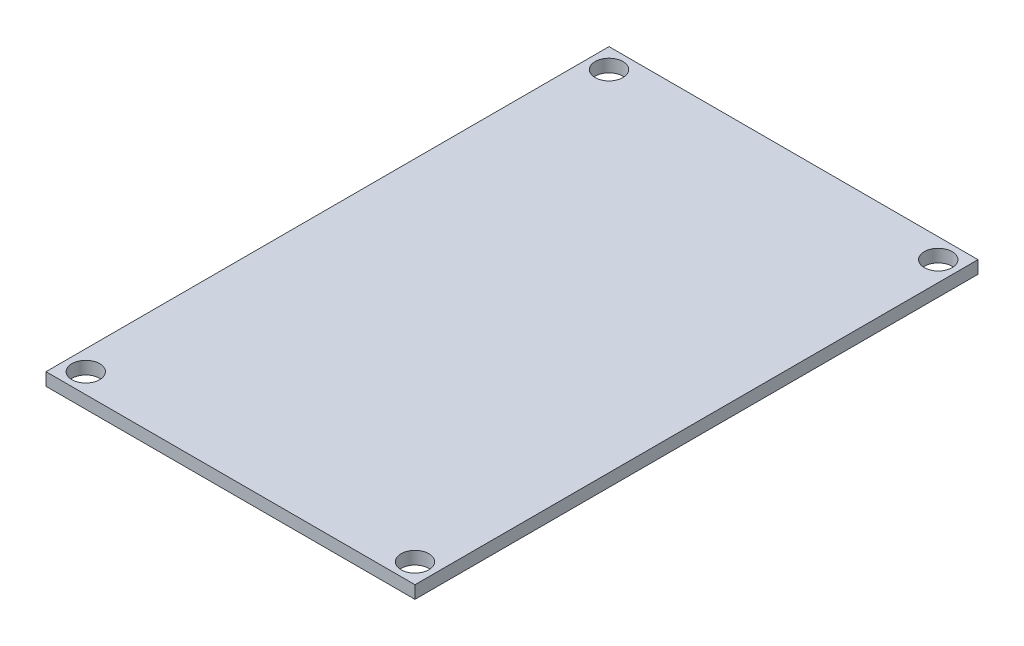
ISO-10303-21;
HEADER;
FILE_DESCRIPTION(('STEP AP214'),'2;1');
FILE_NAME('part.step','',(''),(''),'','','');
FILE_SCHEMA(('AUTOMOTIVE_DESIGN { 1 0 10303 214 1 1 1 1 }'));
ENDSEC;
DATA;
#1=APPLICATION_CONTEXT('core data for automotive mechanical design processes');
#2=APPLICATION_PROTOCOL_DEFINITION('international standard','automotive_design',2000,#1);
#3=PRODUCT_CONTEXT('',#1,'mechanical');
#4=PRODUCT('Part','Part','',(#3));
#5=PRODUCT_RELATED_PRODUCT_CATEGORY('part','',(#4));
#6=PRODUCT_DEFINITION_FORMATION('','',#4);
#7=PRODUCT_DEFINITION_CONTEXT('part definition',#1,'design');
#8=PRODUCT_DEFINITION('design','',#6,#7);
#9=PRODUCT_DEFINITION_SHAPE('','',#8);
#10=(LENGTH_UNIT() NAMED_UNIT(*) SI_UNIT(.MILLI.,.METRE.));
#11=(NAMED_UNIT(*) PLANE_ANGLE_UNIT() SI_UNIT($,.RADIAN.));
#12=(NAMED_UNIT(*) SI_UNIT($,.STERADIAN.) SOLID_ANGLE_UNIT());
#13=UNCERTAINTY_MEASURE_WITH_UNIT(LENGTH_MEASURE(1.E-05),#10,'distance_accuracy_value','');
#14=(GEOMETRIC_REPRESENTATION_CONTEXT(3) GLOBAL_UNCERTAINTY_ASSIGNED_CONTEXT((#13)) GLOBAL_UNIT_ASSIGNED_CONTEXT((#10,
#11,#12)) REPRESENTATION_CONTEXT('',''));
#15=CARTESIAN_POINT('',(0.,0.,0.));
#16=DIRECTION('',(0.,0.,1.));
#17=DIRECTION('',(1.,0.,0.));
#18=AXIS2_PLACEMENT_3D('',#15,#16,#17);
#19=CARTESIAN_POINT('',(23.5712,1.6256,-35.9664));
#20=DIRECTION('',(-1.,0.,0.));
#21=DIRECTION('',(0.,0.,1.));
#22=AXIS2_PLACEMENT_3D('',#19,#20,#21);
#23=PLANE('',#22);
#24=DIRECTION('',(0.,0.,-1.));
#25=VECTOR('',#24,1.);
#26=CARTESIAN_POINT('',(23.5712,0.,-35.9664));
#27=LINE('',#26,#25);
#28=CARTESIAN_POINT('',(23.5712,0.,35.9664));
#29=VERTEX_POINT('',#28);
#30=CARTESIAN_POINT('',(23.5712,0.,-35.9664));
#31=VERTEX_POINT('',#30);
#32=EDGE_CURVE('E96',#29,#31,#27,.T.);
#33=ORIENTED_EDGE('',*,*,#32,.T.);
#34=DIRECTION('',(0.,-1.,0.));
#35=VECTOR('',#34,1.);
#36=CARTESIAN_POINT('',(23.5712,1.6256,-35.9664));
#37=LINE('',#36,#35);
#38=CARTESIAN_POINT('',(23.5712,1.6256,-35.9664));
#39=VERTEX_POINT('',#38);
#40=EDGE_CURVE('E11',#39,#31,#37,.T.);
#41=ORIENTED_EDGE('',*,*,#40,.F.);
#42=DIRECTION('',(0.,0.,-1.));
#43=VECTOR('',#42,1.);
#44=CARTESIAN_POINT('',(23.5712,1.6256,-35.9664));
#45=LINE('',#44,#43);
#46=CARTESIAN_POINT('',(23.5712,1.6256,35.9664));
#47=VERTEX_POINT('',#46);
#48=EDGE_CURVE('E84',#47,#39,#45,.T.);
#49=ORIENTED_EDGE('',*,*,#48,.F.);
#50=DIRECTION('',(0.,-1.,0.));
#51=VECTOR('',#50,1.);
#52=CARTESIAN_POINT('',(23.5712,1.6256,35.9664));
#53=LINE('',#52,#51);
#54=EDGE_CURVE('E92',#47,#29,#53,.T.);
#55=ORIENTED_EDGE('',*,*,#54,.T.);
#56=EDGE_LOOP('',(#33,#41,#49,#55));
#57=FACE_BOUND('',#56,.T.);
#58=ADVANCED_FACE('F33',(#57),#23,.F.);
#59=CARTESIAN_POINT('',(-23.5712,1.6256,-35.9664));
#60=DIRECTION('',(0.,0.,1.));
#61=DIRECTION('',(1.,0.,0.));
#62=AXIS2_PLACEMENT_3D('',#59,#60,#61);
#63=PLANE('',#62);
#64=DIRECTION('',(-1.,0.,0.));
#65=VECTOR('',#64,1.);
#66=CARTESIAN_POINT('',(-23.5712,0.,-35.9664));
#67=LINE('',#66,#65);
#68=CARTESIAN_POINT('',(-23.5712,0.,-35.9664));
#69=VERTEX_POINT('',#68);
#70=EDGE_CURVE('E88',#31,#69,#67,.T.);
#71=ORIENTED_EDGE('',*,*,#70,.T.);
#72=DIRECTION('',(0.,-1.,0.));
#73=VECTOR('',#72,1.);
#74=CARTESIAN_POINT('',(-23.5712,1.6256,-35.9664));
#75=LINE('',#74,#73);
#76=CARTESIAN_POINT('',(-23.5712,1.6256,-35.9664));
#77=VERTEX_POINT('',#76);
#78=EDGE_CURVE('E41',#77,#69,#75,.T.);
#79=ORIENTED_EDGE('',*,*,#78,.F.);
#80=DIRECTION('',(-1.,0.,0.));
#81=VECTOR('',#80,1.);
#82=CARTESIAN_POINT('',(-23.5712,1.6256,-35.9664));
#83=LINE('',#82,#81);
#84=EDGE_CURVE('E79',#39,#77,#83,.T.);
#85=ORIENTED_EDGE('',*,*,#84,.F.);
#86=ORIENTED_EDGE('',*,*,#40,.T.);
#87=EDGE_LOOP('',(#71,#79,#85,#86));
#88=FACE_BOUND('',#87,.T.);
#89=ADVANCED_FACE('F87',(#88),#63,.F.);
#90=CARTESIAN_POINT('',(-23.5712,1.6256,-35.9664));
#91=DIRECTION('',(1.,0.,0.));
#92=DIRECTION('',(0.,0.,-1.));
#93=AXIS2_PLACEMENT_3D('',#90,#91,#92);
#94=PLANE('',#93);
#95=DIRECTION('',(0.,0.,1.));
#96=VECTOR('',#95,1.);
#97=CARTESIAN_POINT('',(-23.5712,0.,-35.9664));
#98=LINE('',#97,#96);
#99=CARTESIAN_POINT('',(-23.5712,0.,35.9664));
#100=VERTEX_POINT('',#99);
#101=EDGE_CURVE('E66',#69,#100,#98,.T.);
#102=ORIENTED_EDGE('',*,*,#101,.T.);
#103=DIRECTION('',(0.,-1.,0.));
#104=VECTOR('',#103,1.);
#105=CARTESIAN_POINT('',(-23.5712,1.6256,35.9664));
#106=LINE('',#105,#104);
#107=CARTESIAN_POINT('',(-23.5712,1.6256,35.9664));
#108=VERTEX_POINT('',#107);
#109=EDGE_CURVE('E89',#108,#100,#106,.T.);
#110=ORIENTED_EDGE('',*,*,#109,.F.);
#111=DIRECTION('',(0.,0.,1.));
#112=VECTOR('',#111,1.);
#113=CARTESIAN_POINT('',(-23.5712,1.6256,-35.9664));
#114=LINE('',#113,#112);
#115=EDGE_CURVE('E82',#77,#108,#114,.T.);
#116=ORIENTED_EDGE('',*,*,#115,.F.);
#117=ORIENTED_EDGE('',*,*,#78,.T.);
#118=EDGE_LOOP('',(#102,#110,#116,#117));
#119=FACE_BOUND('',#118,.T.);
#120=ADVANCED_FACE('F90',(#119),#94,.F.);
#121=CARTESIAN_POINT('',(-23.5712,1.6256,35.9664));
#122=DIRECTION('',(0.,0.,-1.));
#123=DIRECTION('',(-1.,0.,0.));
#124=AXIS2_PLACEMENT_3D('',#121,#122,#123);
#125=PLANE('',#124);
#126=DIRECTION('',(1.,0.,0.));
#127=VECTOR('',#126,1.);
#128=CARTESIAN_POINT('',(-23.5712,0.,35.9664));
#129=LINE('',#128,#127);
#130=EDGE_CURVE('E72',#100,#29,#129,.T.);
#131=ORIENTED_EDGE('',*,*,#130,.T.);
#132=ORIENTED_EDGE('',*,*,#54,.F.);
#133=DIRECTION('',(1.,0.,0.));
#134=VECTOR('',#133,1.);
#135=CARTESIAN_POINT('',(-23.5712,1.6256,35.9664));
#136=LINE('',#135,#134);
#137=EDGE_CURVE('E49',#108,#47,#136,.T.);
#138=ORIENTED_EDGE('',*,*,#137,.F.);
#139=ORIENTED_EDGE('',*,*,#109,.T.);
#140=EDGE_LOOP('',(#131,#132,#138,#139));
#141=FACE_BOUND('',#140,.T.);
#142=ADVANCED_FACE('F104',(#141),#125,.F.);
#143=CARTESIAN_POINT('',(0.,1.6256,0.));
#144=DIRECTION('',(0.,1.,0.));
#145=DIRECTION('',(0.,0.,1.));
#146=AXIS2_PLACEMENT_3D('',#143,#144,#145);
#147=PLANE('',#146);
#148=CARTESIAN_POINT('',(21.0312,1.6256,33.4264));
#149=DIRECTION('',(0.,1.,0.));
#150=DIRECTION('',(0.,0.,1.));
#151=AXIS2_PLACEMENT_3D('',#148,#149,#150);
#152=CIRCLE('',#151,1.778);
#153=CARTESIAN_POINT('',(21.0312,1.6256,35.2044));
#154=VERTEX_POINT('',#153);
#155=EDGE_CURVE('E128',#154,#154,#152,.T.);
#156=ORIENTED_EDGE('',*,*,#155,.F.);
#157=EDGE_LOOP('',(#156));
#158=FACE_BOUND('',#157,.T.);
#159=CARTESIAN_POINT('',(-21.0312,1.6256,33.4264));
#160=DIRECTION('',(0.,1.,0.));
#161=DIRECTION('',(0.,0.,1.));
#162=AXIS2_PLACEMENT_3D('',#159,#160,#161);
#163=CIRCLE('',#162,1.778);
#164=CARTESIAN_POINT('',(-21.0312,1.6256,35.2044));
#165=VERTEX_POINT('',#164);
#166=EDGE_CURVE('E122',#165,#165,#163,.T.);
#167=ORIENTED_EDGE('',*,*,#166,.F.);
#168=EDGE_LOOP('',(#167));
#169=FACE_BOUND('',#168,.T.);
#170=CARTESIAN_POINT('',(21.0312,1.6256,-33.4264));
#171=DIRECTION('',(0.,1.,0.));
#172=DIRECTION('',(0.,0.,1.));
#173=AXIS2_PLACEMENT_3D('',#170,#171,#172);
#174=CIRCLE('',#173,1.778);
#175=CARTESIAN_POINT('',(21.0312,1.6256,-31.6484));
#176=VERTEX_POINT('',#175);
#177=EDGE_CURVE('E116',#176,#176,#174,.T.);
#178=ORIENTED_EDGE('',*,*,#177,.F.);
#179=EDGE_LOOP('',(#178));
#180=FACE_BOUND('',#179,.T.);
#181=CARTESIAN_POINT('',(-21.0312,1.6256,-33.4264));
#182=DIRECTION('',(0.,1.,0.));
#183=DIRECTION('',(0.,0.,1.));
#184=AXIS2_PLACEMENT_3D('',#181,#182,#183);
#185=CIRCLE('',#184,1.778);
#186=CARTESIAN_POINT('',(-21.0312,1.6256,-31.6484));
#187=VERTEX_POINT('',#186);
#188=EDGE_CURVE('E110',#187,#187,#185,.T.);
#189=ORIENTED_EDGE('',*,*,#188,.F.);
#190=EDGE_LOOP('',(#189));
#191=FACE_BOUND('',#190,.T.);
#192=ORIENTED_EDGE('',*,*,#48,.T.);
#193=ORIENTED_EDGE('',*,*,#84,.T.);
#194=ORIENTED_EDGE('',*,*,#115,.T.);
#195=ORIENTED_EDGE('',*,*,#137,.T.);
#196=EDGE_LOOP('',(#192,#193,#194,#195));
#197=FACE_BOUND('',#196,.T.);
#198=ADVANCED_FACE('F80',(#158,#169,#180,#191,#197),#147,.T.);
#199=CARTESIAN_POINT('',(0.,0.,0.));
#200=DIRECTION('',(0.,1.,0.));
#201=DIRECTION('',(0.,0.,1.));
#202=AXIS2_PLACEMENT_3D('',#199,#200,#201);
#203=PLANE('',#202);
#204=CARTESIAN_POINT('',(21.0312,0.,33.4264));
#205=DIRECTION('',(0.,1.,0.));
#206=DIRECTION('',(0.,0.,1.));
#207=AXIS2_PLACEMENT_3D('',#204,#205,#206);
#208=CIRCLE('',#207,1.778);
#209=CARTESIAN_POINT('',(21.0312,0.,35.2044));
#210=VERTEX_POINT('',#209);
#211=EDGE_CURVE('E125',#210,#210,#208,.T.);
#212=ORIENTED_EDGE('',*,*,#211,.T.);
#213=EDGE_LOOP('',(#212));
#214=FACE_BOUND('',#213,.T.);
#215=CARTESIAN_POINT('',(-21.0312,0.,33.4264));
#216=DIRECTION('',(0.,1.,0.));
#217=DIRECTION('',(0.,0.,1.));
#218=AXIS2_PLACEMENT_3D('',#215,#216,#217);
#219=CIRCLE('',#218,1.778);
#220=CARTESIAN_POINT('',(-21.0312,0.,35.2044));
#221=VERTEX_POINT('',#220);
#222=EDGE_CURVE('E119',#221,#221,#219,.T.);
#223=ORIENTED_EDGE('',*,*,#222,.T.);
#224=EDGE_LOOP('',(#223));
#225=FACE_BOUND('',#224,.T.);
#226=CARTESIAN_POINT('',(21.0312,0.,-33.4264));
#227=DIRECTION('',(0.,1.,0.));
#228=DIRECTION('',(0.,0.,1.));
#229=AXIS2_PLACEMENT_3D('',#226,#227,#228);
#230=CIRCLE('',#229,1.778);
#231=CARTESIAN_POINT('',(21.0312,0.,-31.6484));
#232=VERTEX_POINT('',#231);
#233=EDGE_CURVE('E113',#232,#232,#230,.T.);
#234=ORIENTED_EDGE('',*,*,#233,.T.);
#235=EDGE_LOOP('',(#234));
#236=FACE_BOUND('',#235,.T.);
#237=CARTESIAN_POINT('',(-21.0312,0.,-33.4264));
#238=DIRECTION('',(0.,1.,0.));
#239=DIRECTION('',(0.,0.,1.));
#240=AXIS2_PLACEMENT_3D('',#237,#238,#239);
#241=CIRCLE('',#240,1.778);
#242=CARTESIAN_POINT('',(-21.0312,0.,-31.6484));
#243=VERTEX_POINT('',#242);
#244=EDGE_CURVE('E99',#243,#243,#241,.T.);
#245=ORIENTED_EDGE('',*,*,#244,.T.);
#246=EDGE_LOOP('',(#245));
#247=FACE_BOUND('',#246,.T.);
#248=ORIENTED_EDGE('',*,*,#32,.F.);
#249=ORIENTED_EDGE('',*,*,#130,.F.);
#250=ORIENTED_EDGE('',*,*,#101,.F.);
#251=ORIENTED_EDGE('',*,*,#70,.F.);
#252=EDGE_LOOP('',(#248,#249,#250,#251));
#253=FACE_BOUND('',#252,.T.);
#254=ADVANCED_FACE('F107',(#214,#225,#236,#247,#253),#203,.F.);
#255=CARTESIAN_POINT('',(-21.0312,0.,-33.4264));
#256=DIRECTION('',(0.,1.,0.));
#257=DIRECTION('',(0.,0.,1.));
#258=AXIS2_PLACEMENT_3D('',#255,#256,#257);
#259=CYLINDRICAL_SURFACE('',#258,1.778);
#260=ORIENTED_EDGE('',*,*,#244,.F.);
#261=EDGE_LOOP('',(#260));
#262=FACE_BOUND('',#261,.T.);
#263=ORIENTED_EDGE('',*,*,#188,.T.);
#264=EDGE_LOOP('',(#263));
#265=FACE_BOUND('',#264,.T.);
#266=ADVANCED_FACE('F152',(#262,#265),#259,.F.);
#267=CARTESIAN_POINT('',(21.0312,0.,-33.4264));
#268=DIRECTION('',(0.,1.,0.));
#269=DIRECTION('',(0.,0.,1.));
#270=AXIS2_PLACEMENT_3D('',#267,#268,#269);
#271=CYLINDRICAL_SURFACE('',#270,1.778);
#272=ORIENTED_EDGE('',*,*,#233,.F.);
#273=EDGE_LOOP('',(#272));
#274=FACE_BOUND('',#273,.T.);
#275=ORIENTED_EDGE('',*,*,#177,.T.);
#276=EDGE_LOOP('',(#275));
#277=FACE_BOUND('',#276,.T.);
#278=ADVANCED_FACE('F154',(#274,#277),#271,.F.);
#279=CARTESIAN_POINT('',(-21.0312,0.,33.4264));
#280=DIRECTION('',(0.,1.,0.));
#281=DIRECTION('',(0.,0.,1.));
#282=AXIS2_PLACEMENT_3D('',#279,#280,#281);
#283=CYLINDRICAL_SURFACE('',#282,1.778);
#284=ORIENTED_EDGE('',*,*,#222,.F.);
#285=EDGE_LOOP('',(#284));
#286=FACE_BOUND('',#285,.T.);
#287=ORIENTED_EDGE('',*,*,#166,.T.);
#288=EDGE_LOOP('',(#287));
#289=FACE_BOUND('',#288,.T.);
#290=ADVANCED_FACE('F139',(#286,#289),#283,.F.);
#291=CARTESIAN_POINT('',(21.0312,0.,33.4264));
#292=DIRECTION('',(0.,1.,0.));
#293=DIRECTION('',(0.,0.,1.));
#294=AXIS2_PLACEMENT_3D('',#291,#292,#293);
#295=CYLINDRICAL_SURFACE('',#294,1.778);
#296=ORIENTED_EDGE('',*,*,#211,.F.);
#297=EDGE_LOOP('',(#296));
#298=FACE_BOUND('',#297,.T.);
#299=ORIENTED_EDGE('',*,*,#155,.T.);
#300=EDGE_LOOP('',(#299));
#301=FACE_BOUND('',#300,.T.);
#302=ADVANCED_FACE('F136',(#298,#301),#295,.F.);
#303=CLOSED_SHELL('',(#58,#89,#120,#142,#198,#254,#266,#278,#290,#302));
#304=MANIFOLD_SOLID_BREP('B2',#303);
#305=ADVANCED_BREP_SHAPE_REPRESENTATION('',(#18,#304),#14);
#306=SHAPE_DEFINITION_REPRESENTATION(#9,#305);
ENDSEC;
END-ISO-10303-21;
